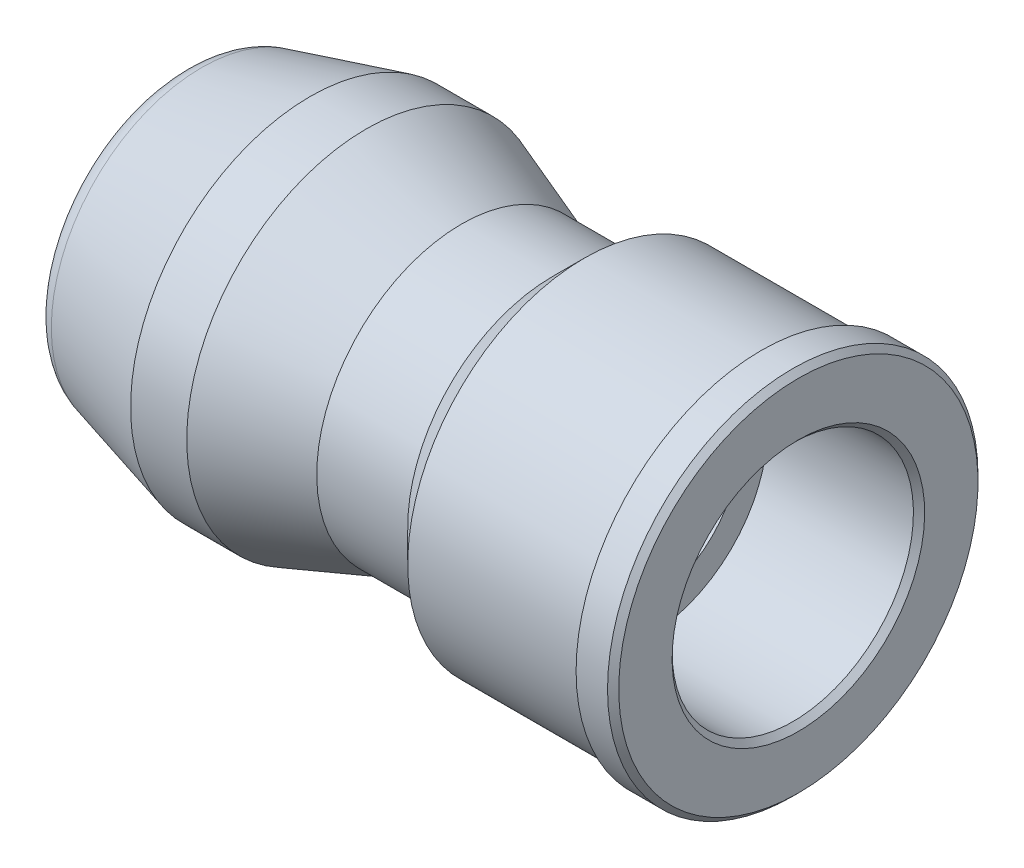
ISO-10303-21;
HEADER;
FILE_DESCRIPTION(('STEP AP214'),'2;1');
FILE_NAME('part.step','',(''),(''),'','','');
FILE_SCHEMA(('AUTOMOTIVE_DESIGN { 1 0 10303 214 1 1 1 1 }'));
ENDSEC;
DATA;
#1=APPLICATION_CONTEXT('core data for automotive mechanical design processes');
#2=APPLICATION_PROTOCOL_DEFINITION('international standard','automotive_design',2000,#1);
#3=PRODUCT_CONTEXT('',#1,'mechanical');
#4=PRODUCT('Part','Part','',(#3));
#5=PRODUCT_RELATED_PRODUCT_CATEGORY('part','',(#4));
#6=PRODUCT_DEFINITION_FORMATION('','',#4);
#7=PRODUCT_DEFINITION_CONTEXT('part definition',#1,'design');
#8=PRODUCT_DEFINITION('design','',#6,#7);
#9=PRODUCT_DEFINITION_SHAPE('','',#8);
#10=(LENGTH_UNIT() NAMED_UNIT(*) SI_UNIT(.MILLI.,.METRE.));
#11=(NAMED_UNIT(*) PLANE_ANGLE_UNIT() SI_UNIT($,.RADIAN.));
#12=(NAMED_UNIT(*) SI_UNIT($,.STERADIAN.) SOLID_ANGLE_UNIT());
#13=UNCERTAINTY_MEASURE_WITH_UNIT(LENGTH_MEASURE(1.E-05),#10,'distance_accuracy_value','');
#14=(GEOMETRIC_REPRESENTATION_CONTEXT(3) GLOBAL_UNCERTAINTY_ASSIGNED_CONTEXT((#13)) GLOBAL_UNIT_ASSIGNED_CONTEXT((#10,
#11,#12)) REPRESENTATION_CONTEXT('',''));
#15=CARTESIAN_POINT('',(0.,0.,0.));
#16=DIRECTION('',(0.,0.,1.));
#17=DIRECTION('',(1.,0.,0.));
#18=AXIS2_PLACEMENT_3D('',#15,#16,#17);
#19=CARTESIAN_POINT('',(0.,0.,0.));
#20=DIRECTION('',(-1.,0.,0.));
#21=DIRECTION('',(0.,-1.,0.));
#22=AXIS2_PLACEMENT_3D('',#19,#20,#21);
#23=PLANE('',#22);
#24=CARTESIAN_POINT('',(0.,0.,0.));
#25=DIRECTION('',(-1.,0.,0.));
#26=DIRECTION('',(0.,-1.,0.));
#27=AXIS2_PLACEMENT_3D('',#24,#25,#26);
#28=CIRCLE('',#27,2.19633650601052);
#29=CARTESIAN_POINT('',(0.,-2.19633650601052,0.));
#30=VERTEX_POINT('',#29);
#31=EDGE_CURVE('E63',#30,#30,#28,.T.);
#32=ORIENTED_EDGE('',*,*,#31,.T.);
#33=EDGE_LOOP('',(#32));
#34=FACE_BOUND('',#33,.T.);
#35=CARTESIAN_POINT('',(0.,0.,0.));
#36=DIRECTION('',(-1.,0.,0.));
#37=DIRECTION('',(0.,0.,1.));
#38=AXIS2_PLACEMENT_3D('',#35,#36,#37);
#39=CIRCLE('',#38,2.025);
#40=CARTESIAN_POINT('',(0.,0.,2.025));
#41=VERTEX_POINT('',#40);
#42=EDGE_CURVE('E96',#41,#41,#39,.T.);
#43=ORIENTED_EDGE('',*,*,#42,.F.);
#44=EDGE_LOOP('',(#43));
#45=FACE_BOUND('',#44,.T.);
#46=ADVANCED_FACE('F36',(#34,#45),#23,.T.);
#47=CARTESIAN_POINT('',(2.3,0.,0.));
#48=DIRECTION('',(1.,0.,0.));
#49=DIRECTION('',(0.,1.,0.));
#50=AXIS2_PLACEMENT_3D('',#47,#48,#49);
#51=CONICAL_SURFACE('',#50,3.19628314259158,0.261799387799147);
#52=CARTESIAN_POINT('',(0.370590477448741,0.,0.));
#53=DIRECTION('',(-1.,0.,0.));
#54=DIRECTION('',(0.,-1.,0.));
#55=AXIS2_PLACEMENT_3D('',#52,#53,#54);
#56=CIRCLE('',#55,2.67929941915505);
#57=CARTESIAN_POINT('',(0.370590477448741,-2.67929941915505,0.));
#58=VERTEX_POINT('',#57);
#59=EDGE_CURVE('E66',#58,#58,#56,.F.);
#60=ORIENTED_EDGE('',*,*,#59,.T.);
#61=EDGE_LOOP('',(#60));
#62=FACE_BOUND('',#61,.T.);
#63=CARTESIAN_POINT('',(2.3,0.,0.));
#64=DIRECTION('',(1.,0.,0.));
#65=DIRECTION('',(0.,1.,0.));
#66=AXIS2_PLACEMENT_3D('',#63,#64,#65);
#67=CIRCLE('',#66,3.19628314259158);
#68=CARTESIAN_POINT('',(2.3,3.19628314259158,0.));
#69=VERTEX_POINT('',#68);
#70=EDGE_CURVE('E69',#69,#69,#67,.T.);
#71=ORIENTED_EDGE('',*,*,#70,.F.);
#72=EDGE_LOOP('',(#71));
#73=FACE_BOUND('',#72,.T.);
#74=ADVANCED_FACE('F103',(#62,#73),#51,.T.);
#75=CARTESIAN_POINT('',(8.3,0.,0.));
#76=DIRECTION('',(1.,0.,0.));
#77=DIRECTION('',(0.,1.,0.));
#78=AXIS2_PLACEMENT_3D('',#75,#76,#77);
#79=CYLINDRICAL_SURFACE('',#78,3.19628314259158);
#80=ORIENTED_EDGE('',*,*,#70,.T.);
#81=EDGE_LOOP('',(#80));
#82=FACE_BOUND('',#81,.T.);
#83=CARTESIAN_POINT('',(3.3,0.,0.));
#84=DIRECTION('',(1.,0.,0.));
#85=DIRECTION('',(0.,1.,0.));
#86=AXIS2_PLACEMENT_3D('',#83,#84,#85);
#87=CIRCLE('',#86,3.19628314259158);
#88=CARTESIAN_POINT('',(3.3,3.19628314259158,0.));
#89=VERTEX_POINT('',#88);
#90=EDGE_CURVE('E77',#89,#89,#87,.T.);
#91=ORIENTED_EDGE('',*,*,#90,.F.);
#92=EDGE_LOOP('',(#91));
#93=FACE_BOUND('',#92,.T.);
#94=ADVANCED_FACE('F109',(#82,#93),#79,.T.);
#95=CARTESIAN_POINT('',(5.,0.,0.));
#96=DIRECTION('',(-1.,0.,0.));
#97=DIRECTION('',(0.,-1.,0.));
#98=AXIS2_PLACEMENT_3D('',#95,#96,#97);
#99=CONICAL_SURFACE('',#98,2.58,0.347784219086138);
#100=ORIENTED_EDGE('',*,*,#90,.T.);
#101=EDGE_LOOP('',(#100));
#102=FACE_BOUND('',#101,.T.);
#103=CARTESIAN_POINT('',(5.,0.,0.));
#104=DIRECTION('',(1.,0.,0.));
#105=DIRECTION('',(0.,1.,0.));
#106=AXIS2_PLACEMENT_3D('',#103,#104,#105);
#107=CIRCLE('',#106,2.58);
#108=CARTESIAN_POINT('',(5.,2.58,0.));
#109=VERTEX_POINT('',#108);
#110=EDGE_CURVE('E80',#109,#109,#107,.T.);
#111=ORIENTED_EDGE('',*,*,#110,.F.);
#112=EDGE_LOOP('',(#111));
#113=FACE_BOUND('',#112,.T.);
#114=ADVANCED_FACE('F178',(#102,#113),#99,.T.);
#115=CARTESIAN_POINT('',(8.3,0.,0.));
#116=DIRECTION('',(1.,0.,0.));
#117=DIRECTION('',(0.,1.,0.));
#118=AXIS2_PLACEMENT_3D('',#115,#116,#117);
#119=CYLINDRICAL_SURFACE('',#118,2.58);
#120=ORIENTED_EDGE('',*,*,#110,.T.);
#121=EDGE_LOOP('',(#120));
#122=FACE_BOUND('',#121,.T.);
#123=CARTESIAN_POINT('',(6.62,0.,0.));
#124=DIRECTION('',(1.,0.,0.));
#125=DIRECTION('',(0.,1.,0.));
#126=AXIS2_PLACEMENT_3D('',#123,#124,#125);
#127=CIRCLE('',#126,2.58);
#128=CARTESIAN_POINT('',(6.62,2.58,0.));
#129=VERTEX_POINT('',#128);
#130=EDGE_CURVE('E83',#129,#129,#127,.T.);
#131=ORIENTED_EDGE('',*,*,#130,.F.);
#132=EDGE_LOOP('',(#131));
#133=FACE_BOUND('',#132,.T.);
#134=ADVANCED_FACE('F174',(#122,#133),#119,.T.);
#135=CARTESIAN_POINT('',(7.19,0.,0.));
#136=DIRECTION('',(1.,0.,0.));
#137=DIRECTION('',(0.,1.,0.));
#138=AXIS2_PLACEMENT_3D('',#135,#136,#137);
#139=CONICAL_SURFACE('',#138,3.15,0.785398163397451);
#140=ORIENTED_EDGE('',*,*,#130,.T.);
#141=EDGE_LOOP('',(#140));
#142=FACE_BOUND('',#141,.T.);
#143=CARTESIAN_POINT('',(7.19,0.,0.));
#144=DIRECTION('',(1.,0.,0.));
#145=DIRECTION('',(0.,1.,0.));
#146=AXIS2_PLACEMENT_3D('',#143,#144,#145);
#147=CIRCLE('',#146,3.15);
#148=CARTESIAN_POINT('',(7.19,3.15,0.));
#149=VERTEX_POINT('',#148);
#150=EDGE_CURVE('E86',#149,#149,#147,.T.);
#151=ORIENTED_EDGE('',*,*,#150,.F.);
#152=EDGE_LOOP('',(#151));
#153=FACE_BOUND('',#152,.T.);
#154=ADVANCED_FACE('F171',(#142,#153),#139,.T.);
#155=CARTESIAN_POINT('',(8.3,0.,0.));
#156=DIRECTION('',(1.,0.,0.));
#157=DIRECTION('',(0.,1.,0.));
#158=AXIS2_PLACEMENT_3D('',#155,#156,#157);
#159=CYLINDRICAL_SURFACE('',#158,3.15);
#160=CARTESIAN_POINT('',(10.24,0.,0.));
#161=DIRECTION('',(-1.,0.,0.));
#162=DIRECTION('',(0.,-1.,0.));
#163=AXIS2_PLACEMENT_3D('',#160,#161,#162);
#164=CIRCLE('',#163,3.15);
#165=CARTESIAN_POINT('',(10.24,-3.15,0.));
#166=VERTEX_POINT('',#165);
#167=EDGE_CURVE('E10',#166,#166,#164,.T.);
#168=ORIENTED_EDGE('',*,*,#167,.T.);
#169=EDGE_LOOP('',(#168));
#170=FACE_BOUND('',#169,.T.);
#171=ORIENTED_EDGE('',*,*,#150,.T.);
#172=EDGE_LOOP('',(#171));
#173=FACE_BOUND('',#172,.T.);
#174=ADVANCED_FACE('F168',(#170,#173),#159,.T.);
#175=CARTESIAN_POINT('',(10.34,3.15,0.));
#176=DIRECTION('',(-1.,0.,0.));
#177=DIRECTION('',(0.,-1.,0.));
#178=AXIS2_PLACEMENT_3D('',#175,#176,#177);
#179=PLANE('',#178);
#180=CARTESIAN_POINT('',(10.34,0.,0.));
#181=DIRECTION('',(-1.,0.,0.));
#182=DIRECTION('',(0.,-1.,0.));
#183=AXIS2_PLACEMENT_3D('',#180,#181,#182);
#184=CIRCLE('',#183,3.25);
#185=CARTESIAN_POINT('',(10.34,-3.25,0.));
#186=VERTEX_POINT('',#185);
#187=EDGE_CURVE('E44',#186,#186,#184,.F.);
#188=ORIENTED_EDGE('',*,*,#187,.T.);
#189=EDGE_LOOP('',(#188));
#190=FACE_BOUND('',#189,.T.);
#191=CARTESIAN_POINT('',(10.34,0.,0.));
#192=DIRECTION('',(1.,0.,0.));
#193=DIRECTION('',(0.,1.,0.));
#194=AXIS2_PLACEMENT_3D('',#191,#192,#193);
#195=CIRCLE('',#194,3.3);
#196=CARTESIAN_POINT('',(10.34,3.3,0.));
#197=VERTEX_POINT('',#196);
#198=EDGE_CURVE('E89',#197,#197,#195,.T.);
#199=ORIENTED_EDGE('',*,*,#198,.F.);
#200=EDGE_LOOP('',(#199));
#201=FACE_BOUND('',#200,.T.);
#202=ADVANCED_FACE('F164',(#190,#201),#179,.T.);
#203=CARTESIAN_POINT('',(8.3,0.,0.));
#204=DIRECTION('',(1.,0.,0.));
#205=DIRECTION('',(0.,1.,0.));
#206=AXIS2_PLACEMENT_3D('',#203,#204,#205);
#207=CYLINDRICAL_SURFACE('',#206,3.3);
#208=CARTESIAN_POINT('',(10.9,0.,0.));
#209=DIRECTION('',(1.,0.,0.));
#210=DIRECTION('',(0.,1.,0.));
#211=AXIS2_PLACEMENT_3D('',#208,#209,#210);
#212=CIRCLE('',#211,3.3);
#213=CARTESIAN_POINT('',(10.9,3.3,0.));
#214=VERTEX_POINT('',#213);
#215=EDGE_CURVE('E52',#214,#214,#212,.F.);
#216=ORIENTED_EDGE('',*,*,#215,.T.);
#217=EDGE_LOOP('',(#216));
#218=FACE_BOUND('',#217,.T.);
#219=ORIENTED_EDGE('',*,*,#198,.T.);
#220=EDGE_LOOP('',(#219));
#221=FACE_BOUND('',#220,.T.);
#222=ADVANCED_FACE('F160',(#218,#221),#207,.T.);
#223=CARTESIAN_POINT('',(11.,3.3,0.));
#224=DIRECTION('',(1.,0.,0.));
#225=DIRECTION('',(0.,1.,0.));
#226=AXIS2_PLACEMENT_3D('',#223,#224,#225);
#227=PLANE('',#226);
#228=CARTESIAN_POINT('',(11.,0.,0.));
#229=DIRECTION('',(1.,0.,0.));
#230=DIRECTION('',(0.,1.,0.));
#231=AXIS2_PLACEMENT_3D('',#228,#229,#230);
#232=CIRCLE('',#231,3.2);
#233=CARTESIAN_POINT('',(11.,3.2,0.));
#234=VERTEX_POINT('',#233);
#235=EDGE_CURVE('E57',#234,#234,#232,.T.);
#236=ORIENTED_EDGE('',*,*,#235,.T.);
#237=EDGE_LOOP('',(#236));
#238=FACE_BOUND('',#237,.T.);
#239=CARTESIAN_POINT('',(11.,0.,0.));
#240=DIRECTION('',(1.,0.,0.));
#241=DIRECTION('',(0.,1.,0.));
#242=AXIS2_PLACEMENT_3D('',#239,#240,#241);
#243=CIRCLE('',#242,2.25);
#244=CARTESIAN_POINT('',(11.,2.25,0.));
#245=VERTEX_POINT('',#244);
#246=EDGE_CURVE('E60',#245,#245,#243,.F.);
#247=ORIENTED_EDGE('',*,*,#246,.T.);
#248=EDGE_LOOP('',(#247));
#249=FACE_BOUND('',#248,.T.);
#250=ADVANCED_FACE('F142',(#238,#249),#227,.T.);
#251=CARTESIAN_POINT('',(8.3,0.,0.));
#252=DIRECTION('',(1.,0.,0.));
#253=DIRECTION('',(0.,1.,0.));
#254=AXIS2_PLACEMENT_3D('',#251,#252,#253);
#255=CYLINDRICAL_SURFACE('',#254,2.15);
#256=CARTESIAN_POINT('',(10.9,0.,0.));
#257=DIRECTION('',(1.,0.,0.));
#258=DIRECTION('',(0.,1.,0.));
#259=AXIS2_PLACEMENT_3D('',#256,#257,#258);
#260=CIRCLE('',#259,2.15);
#261=CARTESIAN_POINT('',(10.9,2.15,0.));
#262=VERTEX_POINT('',#261);
#263=EDGE_CURVE('E48',#262,#262,#260,.T.);
#264=ORIENTED_EDGE('',*,*,#263,.T.);
#265=EDGE_LOOP('',(#264));
#266=FACE_BOUND('',#265,.T.);
#267=CARTESIAN_POINT('',(8.3,0.,0.));
#268=DIRECTION('',(1.,0.,0.));
#269=DIRECTION('',(0.,1.,0.));
#270=AXIS2_PLACEMENT_3D('',#267,#268,#269);
#271=CIRCLE('',#270,2.15);
#272=CARTESIAN_POINT('',(8.3,2.15,0.));
#273=VERTEX_POINT('',#272);
#274=EDGE_CURVE('E73',#273,#273,#271,.T.);
#275=ORIENTED_EDGE('',*,*,#274,.F.);
#276=EDGE_LOOP('',(#275));
#277=FACE_BOUND('',#276,.T.);
#278=ADVANCED_FACE('F138',(#266,#277),#255,.F.);
#279=CARTESIAN_POINT('',(8.3,2.15,0.));
#280=DIRECTION('',(1.,0.,0.));
#281=DIRECTION('',(0.,1.,0.));
#282=AXIS2_PLACEMENT_3D('',#279,#280,#281);
#283=PLANE('',#282);
#284=CARTESIAN_POINT('',(8.3,0.,0.));
#285=DIRECTION('',(1.,0.,0.));
#286=DIRECTION('',(0.,1.,0.));
#287=AXIS2_PLACEMENT_3D('',#284,#285,#286);
#288=CIRCLE('',#287,1.65);
#289=CARTESIAN_POINT('',(8.3,1.65,0.));
#290=VERTEX_POINT('',#289);
#291=EDGE_CURVE('E70',#290,#290,#288,.T.);
#292=ORIENTED_EDGE('',*,*,#291,.F.);
#293=EDGE_LOOP('',(#292));
#294=FACE_BOUND('',#293,.T.);
#295=ORIENTED_EDGE('',*,*,#274,.T.);
#296=EDGE_LOOP('',(#295));
#297=FACE_BOUND('',#296,.T.);
#298=ADVANCED_FACE('F141',(#294,#297),#283,.T.);
#299=CARTESIAN_POINT('',(0.,0.,0.));
#300=DIRECTION('',(-1.,0.,0.));
#301=DIRECTION('',(0.,0.,1.));
#302=AXIS2_PLACEMENT_3D('',#299,#300,#301);
#303=CYLINDRICAL_SURFACE('',#302,1.65);
#304=ORIENTED_EDGE('',*,*,#291,.T.);
#305=EDGE_LOOP('',(#304));
#306=FACE_BOUND('',#305,.T.);
#307=CARTESIAN_POINT('',(0.905330085889916,0.,0.));
#308=DIRECTION('',(-1.,0.,0.));
#309=DIRECTION('',(0.,0.,1.));
#310=AXIS2_PLACEMENT_3D('',#307,#308,#309);
#311=CIRCLE('',#310,1.65);
#312=CARTESIAN_POINT('',(0.905330085889916,0.,1.65));
#313=VERTEX_POINT('',#312);
#314=EDGE_CURVE('E74',#313,#313,#311,.T.);
#315=ORIENTED_EDGE('',*,*,#314,.T.);
#316=EDGE_LOOP('',(#315));
#317=FACE_BOUND('',#316,.T.);
#318=ADVANCED_FACE('F147',(#306,#317),#303,.F.);
#319=CARTESIAN_POINT('',(0.,0.,0.));
#320=DIRECTION('',(-1.,0.,0.));
#321=DIRECTION('',(0.,0.,1.));
#322=AXIS2_PLACEMENT_3D('',#319,#320,#321);
#323=CONICAL_SURFACE('',#322,2.025,0.392699081698723);
#324=ORIENTED_EDGE('',*,*,#314,.F.);
#325=EDGE_LOOP('',(#324));
#326=FACE_BOUND('',#325,.T.);
#327=ORIENTED_EDGE('',*,*,#42,.T.);
#328=EDGE_LOOP('',(#327));
#329=FACE_BOUND('',#328,.T.);
#330=ADVANCED_FACE('F100',(#326,#329),#323,.F.);
#331=CARTESIAN_POINT('',(0.5,0.,0.));
#332=DIRECTION('',(-1.,0.,0.));
#333=DIRECTION('',(0.,-1.,0.));
#334=AXIS2_PLACEMENT_3D('',#331,#332,#333);
#335=TOROIDAL_SURFACE('',#334,2.19633650601052,0.5);
#336=ORIENTED_EDGE('',*,*,#31,.F.);
#337=EDGE_LOOP('',(#336));
#338=FACE_BOUND('',#337,.T.);
#339=ORIENTED_EDGE('',*,*,#59,.F.);
#340=EDGE_LOOP('',(#339));
#341=FACE_BOUND('',#340,.T.);
#342=ADVANCED_FACE('F114',(#338,#341),#335,.T.);
#343=CARTESIAN_POINT('',(11.,0.,0.));
#344=DIRECTION('',(-1.,0.,0.));
#345=DIRECTION('',(0.,-1.,0.));
#346=AXIS2_PLACEMENT_3D('',#343,#344,#345);
#347=CONICAL_SURFACE('',#346,3.2,0.785398163397446);
#348=ORIENTED_EDGE('',*,*,#215,.F.);
#349=EDGE_LOOP('',(#348));
#350=FACE_BOUND('',#349,.T.);
#351=ORIENTED_EDGE('',*,*,#235,.F.);
#352=EDGE_LOOP('',(#351));
#353=FACE_BOUND('',#352,.T.);
#354=ADVANCED_FACE('F117',(#350,#353),#347,.T.);
#355=CARTESIAN_POINT('',(10.9,0.,0.));
#356=DIRECTION('',(1.,0.,0.));
#357=DIRECTION('',(0.,1.,0.));
#358=AXIS2_PLACEMENT_3D('',#355,#356,#357);
#359=CONICAL_SURFACE('',#358,2.15,0.785398163397453);
#360=ORIENTED_EDGE('',*,*,#246,.F.);
#361=EDGE_LOOP('',(#360));
#362=FACE_BOUND('',#361,.T.);
#363=ORIENTED_EDGE('',*,*,#263,.F.);
#364=EDGE_LOOP('',(#363));
#365=FACE_BOUND('',#364,.T.);
#366=ADVANCED_FACE('F124',(#362,#365),#359,.F.);
#367=CARTESIAN_POINT('',(10.34,0.,0.));
#368=DIRECTION('',(1.,0.,0.));
#369=DIRECTION('',(0.,1.,0.));
#370=AXIS2_PLACEMENT_3D('',#367,#368,#369);
#371=CONICAL_SURFACE('',#370,3.25,0.785398163397448);
#372=ORIENTED_EDGE('',*,*,#167,.F.);
#373=EDGE_LOOP('',(#372));
#374=FACE_BOUND('',#373,.T.);
#375=ORIENTED_EDGE('',*,*,#187,.F.);
#376=EDGE_LOOP('',(#375));
#377=FACE_BOUND('',#376,.T.);
#378=ADVANCED_FACE('F39',(#374,#377),#371,.T.);
#379=CLOSED_SHELL('',(#46,#74,#94,#114,#134,#154,#174,#202,#222,#250,#278,#298,#318,#330,#342,
#354,#366,#378));
#380=MANIFOLD_SOLID_BREP('B2',#379);
#381=ADVANCED_BREP_SHAPE_REPRESENTATION('',(#18,#380),#14);
#382=SHAPE_DEFINITION_REPRESENTATION(#9,#381);
ENDSEC;
END-ISO-10303-21;
